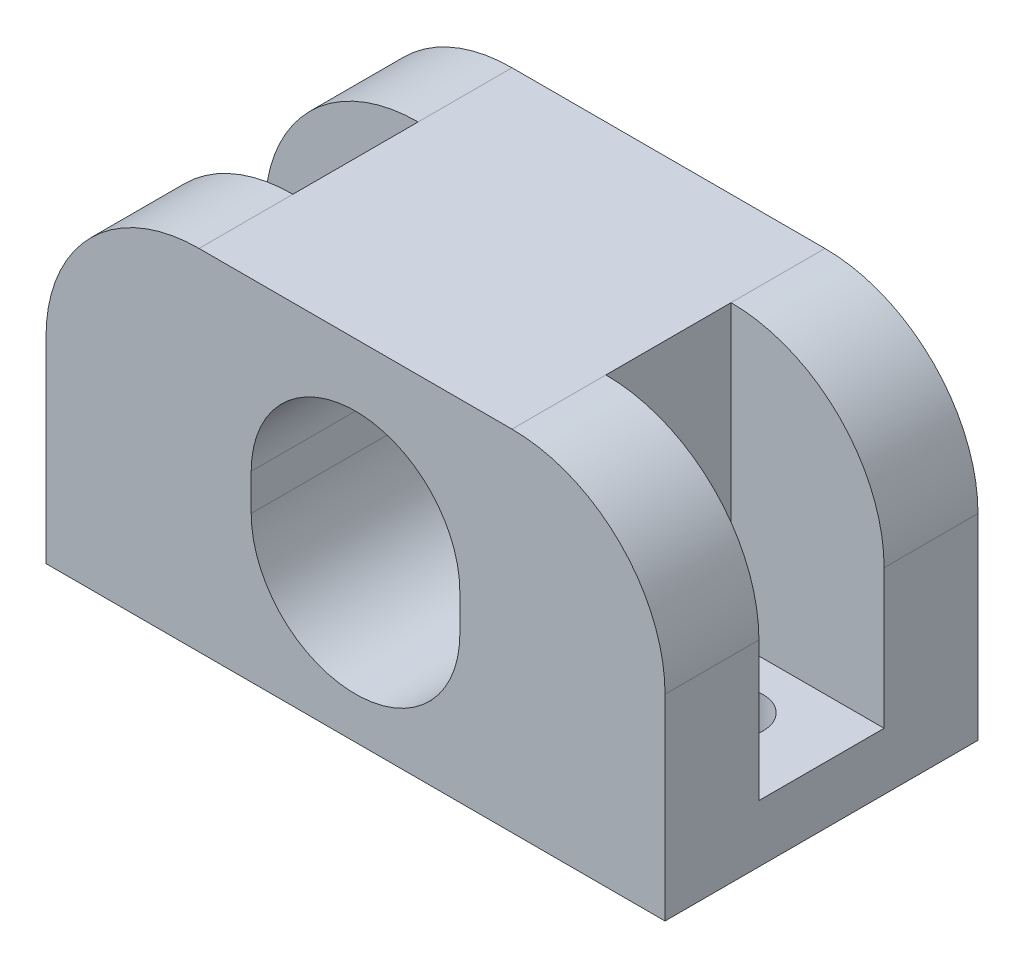
ISO-10303-21;
HEADER;
FILE_DESCRIPTION(('STEP AP214'),'2;1');
FILE_NAME('part.step','',(''),(''),'','','');
FILE_SCHEMA(('AUTOMOTIVE_DESIGN { 1 0 10303 214 1 1 1 1 }'));
ENDSEC;
DATA;
#1=APPLICATION_CONTEXT('core data for automotive mechanical design processes');
#2=APPLICATION_PROTOCOL_DEFINITION('international standard','automotive_design',2000,#1);
#3=PRODUCT_CONTEXT('',#1,'mechanical');
#4=PRODUCT('Part','Part','',(#3));
#5=PRODUCT_RELATED_PRODUCT_CATEGORY('part','',(#4));
#6=PRODUCT_DEFINITION_FORMATION('','',#4);
#7=PRODUCT_DEFINITION_CONTEXT('part definition',#1,'design');
#8=PRODUCT_DEFINITION('design','',#6,#7);
#9=PRODUCT_DEFINITION_SHAPE('','',#8);
#10=(LENGTH_UNIT() NAMED_UNIT(*) SI_UNIT(.MILLI.,.METRE.));
#11=(NAMED_UNIT(*) PLANE_ANGLE_UNIT() SI_UNIT($,.RADIAN.));
#12=(NAMED_UNIT(*) SI_UNIT($,.STERADIAN.) SOLID_ANGLE_UNIT());
#13=UNCERTAINTY_MEASURE_WITH_UNIT(LENGTH_MEASURE(1.E-05),#10,'distance_accuracy_value','');
#14=(GEOMETRIC_REPRESENTATION_CONTEXT(3) GLOBAL_UNCERTAINTY_ASSIGNED_CONTEXT((#13)) GLOBAL_UNIT_ASSIGNED_CONTEXT((#10,
#11,#12)) REPRESENTATION_CONTEXT('',''));
#15=CARTESIAN_POINT('',(0.,0.,0.));
#16=DIRECTION('',(0.,0.,1.));
#17=DIRECTION('',(1.,0.,0.));
#18=AXIS2_PLACEMENT_3D('',#15,#16,#17);
#19=CARTESIAN_POINT('',(7.5,7.415,-15.));
#20=DIRECTION('',(0.,0.,1.));
#21=DIRECTION('',(1.,0.,0.));
#22=AXIS2_PLACEMENT_3D('',#19,#20,#21);
#23=CYLINDRICAL_SURFACE('',#22,7.335);
#24=DIRECTION('',(0.,0.,1.));
#25=VECTOR('',#24,1.);
#26=CARTESIAN_POINT('',(14.835,7.415,-15.));
#27=LINE('',#26,#25);
#28=CARTESIAN_POINT('',(14.835,7.415,-4.5));
#29=VERTEX_POINT('',#28);
#30=CARTESIAN_POINT('',(14.835,7.415,0.));
#31=VERTEX_POINT('',#30);
#32=EDGE_CURVE('E298',#29,#31,#27,.T.);
#33=ORIENTED_EDGE('',*,*,#32,.F.);
#34=CARTESIAN_POINT('',(7.5,7.415,-4.5));
#35=DIRECTION('',(0.,0.,-1.));
#36=DIRECTION('',(-1.,0.,0.));
#37=AXIS2_PLACEMENT_3D('',#34,#35,#36);
#38=CIRCLE('',#37,7.335);
#39=CARTESIAN_POINT('',(7.5,14.75,-4.5));
#40=VERTEX_POINT('',#39);
#41=EDGE_CURVE('E192',#29,#40,#38,.F.);
#42=ORIENTED_EDGE('',*,*,#41,.T.);
#43=DIRECTION('',(0.,0.,1.));
#44=VECTOR('',#43,1.);
#45=CARTESIAN_POINT('',(7.5,14.75,-15.));
#46=LINE('',#45,#44);
#47=CARTESIAN_POINT('',(7.5,14.75,0.));
#48=VERTEX_POINT('',#47);
#49=EDGE_CURVE('E280',#40,#48,#46,.T.);
#50=ORIENTED_EDGE('',*,*,#49,.T.);
#51=CARTESIAN_POINT('',(7.5,7.415,0.));
#52=DIRECTION('',(0.,0.,1.));
#53=DIRECTION('',(-1.,0.,0.));
#54=AXIS2_PLACEMENT_3D('',#51,#52,#53);
#55=CIRCLE('',#54,7.335);
#56=EDGE_CURVE('E256',#31,#48,#55,.T.);
#57=ORIENTED_EDGE('',*,*,#56,.F.);
#58=EDGE_LOOP('',(#33,#42,#50,#57));
#59=FACE_BOUND('',#58,.T.);
#60=ADVANCED_FACE('F43',(#59),#23,.T.);
#61=CARTESIAN_POINT('',(-14.835,-2.,-15.));
#62=DIRECTION('',(-1.,0.,0.));
#63=DIRECTION('',(0.,0.,1.));
#64=AXIS2_PLACEMENT_3D('',#61,#62,#63);
#65=PLANE('',#64);
#66=DIRECTION('',(0.,0.,1.));
#67=VECTOR('',#66,1.);
#68=CARTESIAN_POINT('',(-14.835,0.749999999999999,-10.5));
#69=LINE('',#68,#67);
#70=CARTESIAN_POINT('',(-14.835,0.749999999999999,-10.5));
#71=VERTEX_POINT('',#70);
#72=CARTESIAN_POINT('',(-14.835,0.749999999999999,-4.5));
#73=VERTEX_POINT('',#72);
#74=EDGE_CURVE('E216',#71,#73,#69,.T.);
#75=ORIENTED_EDGE('',*,*,#74,.F.);
#76=DIRECTION('',(0.,1.,0.));
#77=VECTOR('',#76,1.);
#78=CARTESIAN_POINT('',(-14.835,0.749999999999999,-10.5));
#79=LINE('',#78,#77);
#80=CARTESIAN_POINT('',(-14.835,7.415,-10.5));
#81=VERTEX_POINT('',#80);
#82=EDGE_CURVE('E219',#71,#81,#79,.T.);
#83=ORIENTED_EDGE('',*,*,#82,.T.);
#84=DIRECTION('',(0.,0.,1.));
#85=VECTOR('',#84,1.);
#86=CARTESIAN_POINT('',(-14.835,7.415,-15.));
#87=LINE('',#86,#85);
#88=CARTESIAN_POINT('',(-14.835,7.415,-15.));
#89=VERTEX_POINT('',#88);
#90=EDGE_CURVE('E304',#89,#81,#87,.T.);
#91=ORIENTED_EDGE('',*,*,#90,.F.);
#92=DIRECTION('',(0.,-1.,0.));
#93=VECTOR('',#92,1.);
#94=CARTESIAN_POINT('',(-14.835,-2.,-15.));
#95=LINE('',#94,#93);
#96=CARTESIAN_POINT('',(-14.835,-2.,-15.));
#97=VERTEX_POINT('',#96);
#98=EDGE_CURVE('E273',#89,#97,#95,.T.);
#99=ORIENTED_EDGE('',*,*,#98,.T.);
#100=DIRECTION('',(0.,0.,1.));
#101=VECTOR('',#100,1.);
#102=CARTESIAN_POINT('',(-14.835,-2.,-15.));
#103=LINE('',#102,#101);
#104=CARTESIAN_POINT('',(-14.835,-2.,0.));
#105=VERTEX_POINT('',#104);
#106=EDGE_CURVE('E301',#97,#105,#103,.T.);
#107=ORIENTED_EDGE('',*,*,#106,.T.);
#108=DIRECTION('',(0.,-1.,0.));
#109=VECTOR('',#108,1.);
#110=CARTESIAN_POINT('',(-14.835,-2.,0.));
#111=LINE('',#110,#109);
#112=CARTESIAN_POINT('',(-14.835,7.415,0.));
#113=VERTEX_POINT('',#112);
#114=EDGE_CURVE('E289',#113,#105,#111,.T.);
#115=ORIENTED_EDGE('',*,*,#114,.F.);
#116=CARTESIAN_POINT('',(-14.835,7.415,-4.5));
#117=VERTEX_POINT('',#116);
#118=EDGE_CURVE('E307',#117,#113,#87,.T.);
#119=ORIENTED_EDGE('',*,*,#118,.F.);
#120=DIRECTION('',(0.,1.,0.));
#121=VECTOR('',#120,1.);
#122=CARTESIAN_POINT('',(-14.835,0.749999999999999,-4.5));
#123=LINE('',#122,#121);
#124=EDGE_CURVE('E224',#73,#117,#123,.T.);
#125=ORIENTED_EDGE('',*,*,#124,.F.);
#126=EDGE_LOOP('',(#75,#83,#91,#99,#107,#115,#119,#125));
#127=FACE_BOUND('',#126,.T.);
#128=ADVANCED_FACE('F335',(#127),#65,.T.);
#129=CARTESIAN_POINT('',(-7.5,7.415,-15.));
#130=DIRECTION('',(0.,0.,1.));
#131=DIRECTION('',(1.,0.,0.));
#132=AXIS2_PLACEMENT_3D('',#129,#130,#131);
#133=CYLINDRICAL_SURFACE('',#132,7.335);
#134=ORIENTED_EDGE('',*,*,#90,.T.);
#135=CARTESIAN_POINT('',(-7.5,7.415,-10.5));
#136=DIRECTION('',(0.,0.,1.));
#137=DIRECTION('',(1.,0.,0.));
#138=AXIS2_PLACEMENT_3D('',#135,#136,#137);
#139=CIRCLE('',#138,7.335);
#140=CARTESIAN_POINT('',(-7.5,14.75,-10.5));
#141=VERTEX_POINT('',#140);
#142=EDGE_CURVE('E11',#81,#141,#139,.F.);
#143=ORIENTED_EDGE('',*,*,#142,.T.);
#144=DIRECTION('',(0.,0.,1.));
#145=VECTOR('',#144,1.);
#146=CARTESIAN_POINT('',(-7.5,14.75,-15.));
#147=LINE('',#146,#145);
#148=CARTESIAN_POINT('',(-7.5,14.75,-15.));
#149=VERTEX_POINT('',#148);
#150=EDGE_CURVE('E308',#149,#141,#147,.T.);
#151=ORIENTED_EDGE('',*,*,#150,.F.);
#152=CARTESIAN_POINT('',(-7.5,7.415,-15.));
#153=DIRECTION('',(0.,0.,1.));
#154=DIRECTION('',(1.,0.,0.));
#155=AXIS2_PLACEMENT_3D('',#152,#153,#154);
#156=CIRCLE('',#155,7.335);
#157=EDGE_CURVE('E270',#149,#89,#156,.T.);
#158=ORIENTED_EDGE('',*,*,#157,.T.);
#159=EDGE_LOOP('',(#134,#143,#151,#158));
#160=FACE_BOUND('',#159,.T.);
#161=ADVANCED_FACE('F341',(#160),#133,.T.);
#162=CARTESIAN_POINT('',(7.5,7.415,-10.5));
#163=DIRECTION('',(0.,0.,-1.));
#164=DIRECTION('',(-1.,0.,0.));
#165=AXIS2_PLACEMENT_3D('',#162,#163,#164);
#166=CIRCLE('',#165,7.335);
#167=CARTESIAN_POINT('',(14.835,7.415,-10.5));
#168=VERTEX_POINT('',#167);
#169=CARTESIAN_POINT('',(7.5,14.75,-10.5));
#170=VERTEX_POINT('',#169);
#171=EDGE_CURVE('E196',#168,#170,#166,.F.);
#172=ORIENTED_EDGE('',*,*,#171,.F.);
#173=CARTESIAN_POINT('',(14.835,7.415,-15.));
#174=VERTEX_POINT('',#173);
#175=EDGE_CURVE('E191',#174,#168,#27,.T.);
#176=ORIENTED_EDGE('',*,*,#175,.F.);
#177=CARTESIAN_POINT('',(7.5,7.415,-15.));
#178=DIRECTION('',(0.,0.,1.));
#179=DIRECTION('',(-1.,0.,0.));
#180=AXIS2_PLACEMENT_3D('',#177,#178,#179);
#181=CIRCLE('',#180,7.335);
#182=CARTESIAN_POINT('',(7.5,14.75,-15.));
#183=VERTEX_POINT('',#182);
#184=EDGE_CURVE('E263',#174,#183,#181,.T.);
#185=ORIENTED_EDGE('',*,*,#184,.T.);
#186=EDGE_CURVE('E312',#183,#170,#46,.T.);
#187=ORIENTED_EDGE('',*,*,#186,.T.);
#188=EDGE_LOOP('',(#172,#176,#185,#187));
#189=FACE_BOUND('',#188,.T.);
#190=ADVANCED_FACE('F45',(#189),#23,.T.);
#191=CARTESIAN_POINT('',(14.835,-2.,-15.));
#192=DIRECTION('',(1.,0.,0.));
#193=DIRECTION('',(0.,0.,-1.));
#194=AXIS2_PLACEMENT_3D('',#191,#192,#193);
#195=PLANE('',#194);
#196=DIRECTION('',(0.,1.,0.));
#197=VECTOR('',#196,1.);
#198=CARTESIAN_POINT('',(14.835,0.749999999999999,-10.5));
#199=LINE('',#198,#197);
#200=CARTESIAN_POINT('',(14.835,0.749999999999999,-10.5));
#201=VERTEX_POINT('',#200);
#202=EDGE_CURVE('E184',#201,#168,#199,.T.);
#203=ORIENTED_EDGE('',*,*,#202,.F.);
#204=DIRECTION('',(0.,0.,1.));
#205=VECTOR('',#204,1.);
#206=CARTESIAN_POINT('',(14.835,0.749999999999999,-10.5));
#207=LINE('',#206,#205);
#208=CARTESIAN_POINT('',(14.835,0.749999999999999,-4.5));
#209=VERTEX_POINT('',#208);
#210=EDGE_CURVE('E172',#201,#209,#207,.T.);
#211=ORIENTED_EDGE('',*,*,#210,.T.);
#212=DIRECTION('',(0.,1.,0.));
#213=VECTOR('',#212,1.);
#214=CARTESIAN_POINT('',(14.835,0.749999999999999,-4.5));
#215=LINE('',#214,#213);
#216=EDGE_CURVE('E193',#209,#29,#215,.T.);
#217=ORIENTED_EDGE('',*,*,#216,.T.);
#218=ORIENTED_EDGE('',*,*,#32,.T.);
#219=DIRECTION('',(0.,1.,0.));
#220=VECTOR('',#219,1.);
#221=CARTESIAN_POINT('',(14.835,-2.,0.));
#222=LINE('',#221,#220);
#223=CARTESIAN_POINT('',(14.835,-2.,0.));
#224=VERTEX_POINT('',#223);
#225=EDGE_CURVE('E267',#224,#31,#222,.T.);
#226=ORIENTED_EDGE('',*,*,#225,.F.);
#227=DIRECTION('',(0.,0.,1.));
#228=VECTOR('',#227,1.);
#229=CARTESIAN_POINT('',(14.835,-2.,-15.));
#230=LINE('',#229,#228);
#231=CARTESIAN_POINT('',(14.835,-2.,-15.));
#232=VERTEX_POINT('',#231);
#233=EDGE_CURVE('E299',#232,#224,#230,.T.);
#234=ORIENTED_EDGE('',*,*,#233,.F.);
#235=DIRECTION('',(0.,1.,0.));
#236=VECTOR('',#235,1.);
#237=CARTESIAN_POINT('',(14.835,-2.,-15.));
#238=LINE('',#237,#236);
#239=EDGE_CURVE('E278',#232,#174,#238,.T.);
#240=ORIENTED_EDGE('',*,*,#239,.T.);
#241=ORIENTED_EDGE('',*,*,#175,.T.);
#242=EDGE_LOOP('',(#203,#211,#217,#218,#226,#234,#240,#241));
#243=FACE_BOUND('',#242,.T.);
#244=ADVANCED_FACE('F189',(#243),#195,.T.);
#245=CARTESIAN_POINT('',(0.,-2.,-15.));
#246=DIRECTION('',(0.,-1.,0.));
#247=DIRECTION('',(0.,0.,-1.));
#248=AXIS2_PLACEMENT_3D('',#245,#246,#247);
#249=PLANE('',#248);
#250=CARTESIAN_POINT('',(10.54250606,-2.,-7.5));
#251=DIRECTION('',(0.,-1.,0.));
#252=DIRECTION('',(0.,0.,1.));
#253=AXIS2_PLACEMENT_3D('',#250,#251,#252);
#254=CIRCLE('',#253,1.5);
#255=CARTESIAN_POINT('',(10.54250606,-2.,-6.));
#256=VERTEX_POINT('',#255);
#257=EDGE_CURVE('E365',#256,#256,#254,.T.);
#258=ORIENTED_EDGE('',*,*,#257,.F.);
#259=EDGE_LOOP('',(#258));
#260=FACE_BOUND('',#259,.T.);
#261=CARTESIAN_POINT('',(-10.54250606,-2.,-7.5));
#262=DIRECTION('',(0.,1.,0.));
#263=DIRECTION('',(0.,0.,1.));
#264=AXIS2_PLACEMENT_3D('',#261,#262,#263);
#265=CIRCLE('',#264,1.5);
#266=CARTESIAN_POINT('',(-10.54250606,-2.,-6.));
#267=VERTEX_POINT('',#266);
#268=EDGE_CURVE('E203',#267,#267,#265,.T.);
#269=ORIENTED_EDGE('',*,*,#268,.T.);
#270=EDGE_LOOP('',(#269));
#271=FACE_BOUND('',#270,.T.);
#272=DIRECTION('',(1.,0.,0.));
#273=VECTOR('',#272,1.);
#274=CARTESIAN_POINT('',(0.,-2.,0.));
#275=LINE('',#274,#273);
#276=EDGE_CURVE('E292',#105,#224,#275,.T.);
#277=ORIENTED_EDGE('',*,*,#276,.F.);
#278=ORIENTED_EDGE('',*,*,#106,.F.);
#279=DIRECTION('',(1.,0.,0.));
#280=VECTOR('',#279,1.);
#281=CARTESIAN_POINT('',(0.,-2.,-15.));
#282=LINE('',#281,#280);
#283=EDGE_CURVE('E276',#97,#232,#282,.T.);
#284=ORIENTED_EDGE('',*,*,#283,.T.);
#285=ORIENTED_EDGE('',*,*,#233,.T.);
#286=EDGE_LOOP('',(#277,#278,#284,#285));
#287=FACE_BOUND('',#286,.T.);
#288=ADVANCED_FACE('F349',(#260,#271,#287),#249,.T.);
#289=CARTESIAN_POINT('',(-7.5,7.415,-4.5));
#290=DIRECTION('',(0.,0.,1.));
#291=DIRECTION('',(1.,0.,0.));
#292=AXIS2_PLACEMENT_3D('',#289,#290,#291);
#293=CIRCLE('',#292,7.335);
#294=CARTESIAN_POINT('',(-7.5,14.75,-4.5));
#295=VERTEX_POINT('',#294);
#296=EDGE_CURVE('E52',#117,#295,#293,.F.);
#297=ORIENTED_EDGE('',*,*,#296,.F.);
#298=ORIENTED_EDGE('',*,*,#118,.T.);
#299=CARTESIAN_POINT('',(-7.5,7.415,0.));
#300=DIRECTION('',(0.,0.,1.));
#301=DIRECTION('',(1.,0.,0.));
#302=AXIS2_PLACEMENT_3D('',#299,#300,#301);
#303=CIRCLE('',#302,7.335);
#304=CARTESIAN_POINT('',(-7.5,14.75,0.));
#305=VERTEX_POINT('',#304);
#306=EDGE_CURVE('E286',#305,#113,#303,.T.);
#307=ORIENTED_EDGE('',*,*,#306,.F.);
#308=EDGE_CURVE('E311',#295,#305,#147,.T.);
#309=ORIENTED_EDGE('',*,*,#308,.F.);
#310=EDGE_LOOP('',(#297,#298,#307,#309));
#311=FACE_BOUND('',#310,.T.);
#312=ADVANCED_FACE('F354',(#311),#133,.T.);
#313=CARTESIAN_POINT('',(-7.5,14.75,-15.));
#314=DIRECTION('',(0.,1.,0.));
#315=DIRECTION('',(-1.,0.,0.));
#316=AXIS2_PLACEMENT_3D('',#313,#314,#315);
#317=PLANE('',#316);
#318=DIRECTION('',(-1.,0.,0.));
#319=VECTOR('',#318,1.);
#320=CARTESIAN_POINT('',(-7.5,14.75,0.));
#321=LINE('',#320,#319);
#322=EDGE_CURVE('E283',#48,#305,#321,.T.);
#323=ORIENTED_EDGE('',*,*,#322,.F.);
#324=ORIENTED_EDGE('',*,*,#49,.F.);
#325=DIRECTION('',(0.,0.,1.));
#326=VECTOR('',#325,1.);
#327=CARTESIAN_POINT('',(7.5,14.75,-10.5));
#328=LINE('',#327,#326);
#329=EDGE_CURVE('E186',#170,#40,#328,.T.);
#330=ORIENTED_EDGE('',*,*,#329,.F.);
#331=ORIENTED_EDGE('',*,*,#186,.F.);
#332=DIRECTION('',(-1.,0.,0.));
#333=VECTOR('',#332,1.);
#334=CARTESIAN_POINT('',(-7.5,14.75,-15.));
#335=LINE('',#334,#333);
#336=EDGE_CURVE('E266',#183,#149,#335,.T.);
#337=ORIENTED_EDGE('',*,*,#336,.T.);
#338=ORIENTED_EDGE('',*,*,#150,.T.);
#339=DIRECTION('',(0.,0.,1.));
#340=VECTOR('',#339,1.);
#341=CARTESIAN_POINT('',(-7.5,14.75,-10.5));
#342=LINE('',#341,#340);
#343=EDGE_CURVE('E211',#141,#295,#342,.T.);
#344=ORIENTED_EDGE('',*,*,#343,.T.);
#345=ORIENTED_EDGE('',*,*,#308,.T.);
#346=EDGE_LOOP('',(#323,#324,#330,#331,#337,#338,#344,#345));
#347=FACE_BOUND('',#346,.T.);
#348=ADVANCED_FACE('F360',(#347),#317,.T.);
#349=CARTESIAN_POINT('',(7.5,7.415,-15.));
#350=DIRECTION('',(0.,0.,-1.));
#351=DIRECTION('',(-1.,0.,0.));
#352=AXIS2_PLACEMENT_3D('',#349,#350,#351);
#353=PLANE('',#352);
#354=CARTESIAN_POINT('',(0.,5.,-15.));
#355=DIRECTION('',(0.,0.,1.));
#356=DIRECTION('',(1.,0.,0.));
#357=AXIS2_PLACEMENT_3D('',#354,#355,#356);
#358=CIRCLE('',#357,5.);
#359=CARTESIAN_POINT('',(-5.,5.,-15.));
#360=VERTEX_POINT('',#359);
#361=CARTESIAN_POINT('',(5.,5.,-15.));
#362=VERTEX_POINT('',#361);
#363=EDGE_CURVE('E231',#360,#362,#358,.T.);
#364=ORIENTED_EDGE('',*,*,#363,.T.);
#365=DIRECTION('',(0.,1.,0.));
#366=VECTOR('',#365,1.);
#367=CARTESIAN_POINT('',(5.,6.75,-15.));
#368=LINE('',#367,#366);
#369=CARTESIAN_POINT('',(5.,6.75,-15.));
#370=VERTEX_POINT('',#369);
#371=EDGE_CURVE('E234',#362,#370,#368,.T.);
#372=ORIENTED_EDGE('',*,*,#371,.T.);
#373=CARTESIAN_POINT('',(0.,6.75,-15.));
#374=DIRECTION('',(0.,0.,1.));
#375=DIRECTION('',(-1.,0.,0.));
#376=AXIS2_PLACEMENT_3D('',#373,#374,#375);
#377=CIRCLE('',#376,5.);
#378=CARTESIAN_POINT('',(-5.,6.75,-15.));
#379=VERTEX_POINT('',#378);
#380=EDGE_CURVE('E238',#370,#379,#377,.T.);
#381=ORIENTED_EDGE('',*,*,#380,.T.);
#382=DIRECTION('',(0.,-1.,0.));
#383=VECTOR('',#382,1.);
#384=CARTESIAN_POINT('',(-5.,6.75,-15.));
#385=LINE('',#384,#383);
#386=EDGE_CURVE('E241',#379,#360,#385,.T.);
#387=ORIENTED_EDGE('',*,*,#386,.T.);
#388=EDGE_LOOP('',(#364,#372,#381,#387));
#389=FACE_BOUND('',#388,.T.);
#390=ORIENTED_EDGE('',*,*,#184,.F.);
#391=ORIENTED_EDGE('',*,*,#239,.F.);
#392=ORIENTED_EDGE('',*,*,#283,.F.);
#393=ORIENTED_EDGE('',*,*,#98,.F.);
#394=ORIENTED_EDGE('',*,*,#157,.F.);
#395=ORIENTED_EDGE('',*,*,#336,.F.);
#396=EDGE_LOOP('',(#390,#391,#392,#393,#394,#395));
#397=FACE_BOUND('',#396,.T.);
#398=ADVANCED_FACE('F405',(#389,#397),#353,.T.);
#399=CARTESIAN_POINT('',(7.5,7.415,0.));
#400=DIRECTION('',(0.,0.,-1.));
#401=DIRECTION('',(-1.,0.,0.));
#402=AXIS2_PLACEMENT_3D('',#399,#400,#401);
#403=PLANE('',#402);
#404=DIRECTION('',(0.,1.,0.));
#405=VECTOR('',#404,1.);
#406=CARTESIAN_POINT('',(5.,6.75,0.));
#407=LINE('',#406,#405);
#408=CARTESIAN_POINT('',(5.,5.,0.));
#409=VERTEX_POINT('',#408);
#410=CARTESIAN_POINT('',(5.,6.75,0.));
#411=VERTEX_POINT('',#410);
#412=EDGE_CURVE('E246',#409,#411,#407,.T.);
#413=ORIENTED_EDGE('',*,*,#412,.F.);
#414=CARTESIAN_POINT('',(0.,5.,0.));
#415=DIRECTION('',(0.,0.,1.));
#416=DIRECTION('',(1.,0.,0.));
#417=AXIS2_PLACEMENT_3D('',#414,#415,#416);
#418=CIRCLE('',#417,5.);
#419=CARTESIAN_POINT('',(-5.,5.,0.));
#420=VERTEX_POINT('',#419);
#421=EDGE_CURVE('E230',#420,#409,#418,.T.);
#422=ORIENTED_EDGE('',*,*,#421,.F.);
#423=DIRECTION('',(0.,-1.,0.));
#424=VECTOR('',#423,1.);
#425=CARTESIAN_POINT('',(-5.,6.75,0.));
#426=LINE('',#425,#424);
#427=CARTESIAN_POINT('',(-5.,6.75,0.));
#428=VERTEX_POINT('',#427);
#429=EDGE_CURVE('E235',#428,#420,#426,.T.);
#430=ORIENTED_EDGE('',*,*,#429,.F.);
#431=CARTESIAN_POINT('',(0.,6.75,0.));
#432=DIRECTION('',(0.,0.,1.));
#433=DIRECTION('',(-1.,0.,0.));
#434=AXIS2_PLACEMENT_3D('',#431,#432,#433);
#435=CIRCLE('',#434,5.);
#436=EDGE_CURVE('E249',#411,#428,#435,.T.);
#437=ORIENTED_EDGE('',*,*,#436,.F.);
#438=EDGE_LOOP('',(#413,#422,#430,#437));
#439=FACE_BOUND('',#438,.T.);
#440=ORIENTED_EDGE('',*,*,#56,.T.);
#441=ORIENTED_EDGE('',*,*,#322,.T.);
#442=ORIENTED_EDGE('',*,*,#306,.T.);
#443=ORIENTED_EDGE('',*,*,#114,.T.);
#444=ORIENTED_EDGE('',*,*,#276,.T.);
#445=ORIENTED_EDGE('',*,*,#225,.T.);
#446=EDGE_LOOP('',(#440,#441,#442,#443,#444,#445));
#447=FACE_BOUND('',#446,.T.);
#448=ADVANCED_FACE('F391',(#439,#447),#403,.F.);
#449=CARTESIAN_POINT('',(0.,5.,-15.));
#450=DIRECTION('',(0.,0.,1.));
#451=DIRECTION('',(1.,0.,0.));
#452=AXIS2_PLACEMENT_3D('',#449,#450,#451);
#453=CYLINDRICAL_SURFACE('',#452,5.);
#454=ORIENTED_EDGE('',*,*,#421,.T.);
#455=DIRECTION('',(0.,0.,1.));
#456=VECTOR('',#455,1.);
#457=CARTESIAN_POINT('',(5.,5.,-15.));
#458=LINE('',#457,#456);
#459=EDGE_CURVE('E244',#362,#409,#458,.T.);
#460=ORIENTED_EDGE('',*,*,#459,.F.);
#461=ORIENTED_EDGE('',*,*,#363,.F.);
#462=DIRECTION('',(0.,0.,1.));
#463=VECTOR('',#462,1.);
#464=CARTESIAN_POINT('',(-5.,5.,-15.));
#465=LINE('',#464,#463);
#466=EDGE_CURVE('E254',#360,#420,#465,.T.);
#467=ORIENTED_EDGE('',*,*,#466,.T.);
#468=EDGE_LOOP('',(#454,#460,#461,#467));
#469=FACE_BOUND('',#468,.T.);
#470=ADVANCED_FACE('F414',(#469),#453,.F.);
#471=CARTESIAN_POINT('',(-5.,6.75,-15.));
#472=DIRECTION('',(-1.,0.,0.));
#473=DIRECTION('',(0.,0.,1.));
#474=AXIS2_PLACEMENT_3D('',#471,#472,#473);
#475=PLANE('',#474);
#476=ORIENTED_EDGE('',*,*,#429,.T.);
#477=ORIENTED_EDGE('',*,*,#466,.F.);
#478=ORIENTED_EDGE('',*,*,#386,.F.);
#479=DIRECTION('',(0.,0.,1.));
#480=VECTOR('',#479,1.);
#481=CARTESIAN_POINT('',(-5.,6.75,-15.));
#482=LINE('',#481,#480);
#483=EDGE_CURVE('E257',#379,#428,#482,.T.);
#484=ORIENTED_EDGE('',*,*,#483,.T.);
#485=EDGE_LOOP('',(#476,#477,#478,#484));
#486=FACE_BOUND('',#485,.T.);
#487=ADVANCED_FACE('F544',(#486),#475,.F.);
#488=CARTESIAN_POINT('',(0.,6.75,-15.));
#489=DIRECTION('',(0.,0.,1.));
#490=DIRECTION('',(1.,0.,0.));
#491=AXIS2_PLACEMENT_3D('',#488,#489,#490);
#492=CYLINDRICAL_SURFACE('',#491,5.);
#493=ORIENTED_EDGE('',*,*,#436,.T.);
#494=ORIENTED_EDGE('',*,*,#483,.F.);
#495=ORIENTED_EDGE('',*,*,#380,.F.);
#496=DIRECTION('',(0.,0.,1.));
#497=VECTOR('',#496,1.);
#498=CARTESIAN_POINT('',(5.,6.75,-15.));
#499=LINE('',#498,#497);
#500=EDGE_CURVE('E259',#370,#411,#499,.T.);
#501=ORIENTED_EDGE('',*,*,#500,.T.);
#502=EDGE_LOOP('',(#493,#494,#495,#501));
#503=FACE_BOUND('',#502,.T.);
#504=ADVANCED_FACE('F552',(#503),#492,.F.);
#505=CARTESIAN_POINT('',(5.,6.75,-15.));
#506=DIRECTION('',(1.,0.,0.));
#507=DIRECTION('',(0.,0.,-1.));
#508=AXIS2_PLACEMENT_3D('',#505,#506,#507);
#509=PLANE('',#508);
#510=ORIENTED_EDGE('',*,*,#412,.T.);
#511=ORIENTED_EDGE('',*,*,#500,.F.);
#512=ORIENTED_EDGE('',*,*,#371,.F.);
#513=ORIENTED_EDGE('',*,*,#459,.T.);
#514=EDGE_LOOP('',(#510,#511,#512,#513));
#515=FACE_BOUND('',#514,.T.);
#516=ADVANCED_FACE('F434',(#515),#509,.F.);
#517=CARTESIAN_POINT('',(-14.835,0.749999999999999,-10.5));
#518=DIRECTION('',(0.,0.,1.));
#519=DIRECTION('',(1.,0.,0.));
#520=AXIS2_PLACEMENT_3D('',#517,#518,#519);
#521=PLANE('',#520);
#522=ORIENTED_EDGE('',*,*,#82,.F.);
#523=DIRECTION('',(1.,0.,0.));
#524=VECTOR('',#523,1.);
#525=CARTESIAN_POINT('',(-14.835,0.749999999999999,-10.5));
#526=LINE('',#525,#524);
#527=CARTESIAN_POINT('',(-7.5,0.749999999999999,-10.5));
#528=VERTEX_POINT('',#527);
#529=EDGE_CURVE('E207',#71,#528,#526,.T.);
#530=ORIENTED_EDGE('',*,*,#529,.T.);
#531=DIRECTION('',(0.,1.,0.));
#532=VECTOR('',#531,1.);
#533=CARTESIAN_POINT('',(-7.5,0.749999999999999,-10.5));
#534=LINE('',#533,#532);
#535=EDGE_CURVE('E227',#528,#141,#534,.T.);
#536=ORIENTED_EDGE('',*,*,#535,.T.);
#537=ORIENTED_EDGE('',*,*,#142,.F.);
#538=EDGE_LOOP('',(#522,#530,#536,#537));
#539=FACE_BOUND('',#538,.T.);
#540=ADVANCED_FACE('F401',(#539),#521,.T.);
#541=CARTESIAN_POINT('',(-7.5,0.749999999999999,-10.5));
#542=DIRECTION('',(-1.,0.,0.));
#543=DIRECTION('',(0.,0.,1.));
#544=AXIS2_PLACEMENT_3D('',#541,#542,#543);
#545=PLANE('',#544);
#546=ORIENTED_EDGE('',*,*,#343,.F.);
#547=ORIENTED_EDGE('',*,*,#535,.F.);
#548=DIRECTION('',(0.,0.,1.));
#549=VECTOR('',#548,1.);
#550=CARTESIAN_POINT('',(-7.5,0.749999999999999,-10.5));
#551=LINE('',#550,#549);
#552=CARTESIAN_POINT('',(-7.5,0.749999999999999,-4.5));
#553=VERTEX_POINT('',#552);
#554=EDGE_CURVE('E210',#528,#553,#551,.T.);
#555=ORIENTED_EDGE('',*,*,#554,.T.);
#556=DIRECTION('',(0.,1.,0.));
#557=VECTOR('',#556,1.);
#558=CARTESIAN_POINT('',(-7.5,0.749999999999999,-4.5));
#559=LINE('',#558,#557);
#560=EDGE_CURVE('E68',#553,#295,#559,.T.);
#561=ORIENTED_EDGE('',*,*,#560,.T.);
#562=EDGE_LOOP('',(#546,#547,#555,#561));
#563=FACE_BOUND('',#562,.T.);
#564=ADVANCED_FACE('F402',(#563),#545,.T.);
#565=CARTESIAN_POINT('',(-14.835,0.749999999999999,-4.5));
#566=DIRECTION('',(0.,0.,1.));
#567=DIRECTION('',(1.,0.,0.));
#568=AXIS2_PLACEMENT_3D('',#565,#566,#567);
#569=PLANE('',#568);
#570=ORIENTED_EDGE('',*,*,#296,.T.);
#571=ORIENTED_EDGE('',*,*,#560,.F.);
#572=DIRECTION('',(1.,0.,0.));
#573=VECTOR('',#572,1.);
#574=CARTESIAN_POINT('',(-14.835,0.749999999999999,-4.5));
#575=LINE('',#574,#573);
#576=EDGE_CURVE('E213',#73,#553,#575,.T.);
#577=ORIENTED_EDGE('',*,*,#576,.F.);
#578=ORIENTED_EDGE('',*,*,#124,.T.);
#579=EDGE_LOOP('',(#570,#571,#577,#578));
#580=FACE_BOUND('',#579,.T.);
#581=ADVANCED_FACE('F332',(#580),#569,.F.);
#582=CARTESIAN_POINT('',(0.,0.749999999999999,0.));
#583=DIRECTION('',(0.,-1.,0.));
#584=DIRECTION('',(0.,0.,-1.));
#585=AXIS2_PLACEMENT_3D('',#582,#583,#584);
#586=PLANE('',#585);
#587=CARTESIAN_POINT('',(-10.54250606,0.749999999999999,-7.5));
#588=DIRECTION('',(0.,-1.,0.));
#589=DIRECTION('',(0.,0.,-1.));
#590=AXIS2_PLACEMENT_3D('',#587,#588,#589);
#591=CIRCLE('',#590,1.5);
#592=CARTESIAN_POINT('',(-10.54250606,0.749999999999999,-9.));
#593=VERTEX_POINT('',#592);
#594=EDGE_CURVE('E206',#593,#593,#591,.T.);
#595=ORIENTED_EDGE('',*,*,#594,.T.);
#596=EDGE_LOOP('',(#595));
#597=FACE_BOUND('',#596,.T.);
#598=ORIENTED_EDGE('',*,*,#529,.F.);
#599=ORIENTED_EDGE('',*,*,#74,.T.);
#600=ORIENTED_EDGE('',*,*,#576,.T.);
#601=ORIENTED_EDGE('',*,*,#554,.F.);
#602=EDGE_LOOP('',(#598,#599,#600,#601));
#603=FACE_BOUND('',#602,.T.);
#604=ADVANCED_FACE('F318',(#597,#603),#586,.F.);
#605=CARTESIAN_POINT('',(-10.54250606,-2.,-7.5));
#606=DIRECTION('',(0.,1.,0.));
#607=DIRECTION('',(0.,0.,1.));
#608=AXIS2_PLACEMENT_3D('',#605,#606,#607);
#609=CYLINDRICAL_SURFACE('',#608,1.5);
#610=ORIENTED_EDGE('',*,*,#268,.F.);
#611=EDGE_LOOP('',(#610));
#612=FACE_BOUND('',#611,.T.);
#613=ORIENTED_EDGE('',*,*,#594,.F.);
#614=EDGE_LOOP('',(#613));
#615=FACE_BOUND('',#614,.T.);
#616=ADVANCED_FACE('F321',(#612,#615),#609,.F.);
#617=CARTESIAN_POINT('',(14.835,0.749999999999999,-10.5));
#618=DIRECTION('',(0.,0.,-1.));
#619=DIRECTION('',(-1.,0.,0.));
#620=AXIS2_PLACEMENT_3D('',#617,#618,#619);
#621=PLANE('',#620);
#622=ORIENTED_EDGE('',*,*,#171,.T.);
#623=DIRECTION('',(0.,1.,0.));
#624=VECTOR('',#623,1.);
#625=CARTESIAN_POINT('',(7.5,0.749999999999999,-10.5));
#626=LINE('',#625,#624);
#627=CARTESIAN_POINT('',(7.5,0.749999999999999,-10.5));
#628=VERTEX_POINT('',#627);
#629=EDGE_CURVE('E60',#628,#170,#626,.T.);
#630=ORIENTED_EDGE('',*,*,#629,.F.);
#631=DIRECTION('',(-1.,0.,0.));
#632=VECTOR('',#631,1.);
#633=CARTESIAN_POINT('',(14.835,0.749999999999999,-10.5));
#634=LINE('',#633,#632);
#635=EDGE_CURVE('E176',#201,#628,#634,.T.);
#636=ORIENTED_EDGE('',*,*,#635,.F.);
#637=ORIENTED_EDGE('',*,*,#202,.T.);
#638=EDGE_LOOP('',(#622,#630,#636,#637));
#639=FACE_BOUND('',#638,.T.);
#640=ADVANCED_FACE('F183',(#639),#621,.F.);
#641=CARTESIAN_POINT('',(14.835,0.749999999999999,-4.5));
#642=DIRECTION('',(0.,0.,-1.));
#643=DIRECTION('',(-1.,0.,0.));
#644=AXIS2_PLACEMENT_3D('',#641,#642,#643);
#645=PLANE('',#644);
#646=ORIENTED_EDGE('',*,*,#216,.F.);
#647=DIRECTION('',(-1.,0.,0.));
#648=VECTOR('',#647,1.);
#649=CARTESIAN_POINT('',(14.835,0.749999999999999,-4.5));
#650=LINE('',#649,#648);
#651=CARTESIAN_POINT('',(7.5,0.749999999999999,-4.5));
#652=VERTEX_POINT('',#651);
#653=EDGE_CURVE('E177',#209,#652,#650,.T.);
#654=ORIENTED_EDGE('',*,*,#653,.T.);
#655=DIRECTION('',(0.,1.,0.));
#656=VECTOR('',#655,1.);
#657=CARTESIAN_POINT('',(7.5,0.749999999999999,-4.5));
#658=LINE('',#657,#656);
#659=EDGE_CURVE('E198',#652,#40,#658,.T.);
#660=ORIENTED_EDGE('',*,*,#659,.T.);
#661=ORIENTED_EDGE('',*,*,#41,.F.);
#662=EDGE_LOOP('',(#646,#654,#660,#661));
#663=FACE_BOUND('',#662,.T.);
#664=ADVANCED_FACE('F330',(#663),#645,.T.);
#665=CARTESIAN_POINT('',(7.5,0.749999999999999,-10.5));
#666=DIRECTION('',(-1.,0.,0.));
#667=DIRECTION('',(0.,0.,1.));
#668=AXIS2_PLACEMENT_3D('',#665,#666,#667);
#669=PLANE('',#668);
#670=ORIENTED_EDGE('',*,*,#329,.T.);
#671=ORIENTED_EDGE('',*,*,#659,.F.);
#672=DIRECTION('',(0.,0.,1.));
#673=VECTOR('',#672,1.);
#674=CARTESIAN_POINT('',(7.5,0.749999999999999,-10.5));
#675=LINE('',#674,#673);
#676=EDGE_CURVE('E368',#628,#652,#675,.T.);
#677=ORIENTED_EDGE('',*,*,#676,.F.);
#678=ORIENTED_EDGE('',*,*,#629,.T.);
#679=EDGE_LOOP('',(#670,#671,#677,#678));
#680=FACE_BOUND('',#679,.T.);
#681=ADVANCED_FACE('F371',(#680),#669,.F.);
#682=CARTESIAN_POINT('',(0.,0.749999999999999,0.));
#683=DIRECTION('',(0.,-1.,0.));
#684=DIRECTION('',(0.,0.,-1.));
#685=AXIS2_PLACEMENT_3D('',#682,#683,#684);
#686=PLANE('',#685);
#687=CARTESIAN_POINT('',(10.54250606,0.749999999999999,-7.5));
#688=DIRECTION('',(0.,-1.,0.));
#689=DIRECTION('',(0.,0.,-1.));
#690=AXIS2_PLACEMENT_3D('',#687,#688,#689);
#691=CIRCLE('',#690,1.5);
#692=CARTESIAN_POINT('',(10.54250606,0.749999999999999,-9.));
#693=VERTEX_POINT('',#692);
#694=EDGE_CURVE('E47',#693,#693,#691,.F.);
#695=ORIENTED_EDGE('',*,*,#694,.F.);
#696=EDGE_LOOP('',(#695));
#697=FACE_BOUND('',#696,.T.);
#698=ORIENTED_EDGE('',*,*,#635,.T.);
#699=ORIENTED_EDGE('',*,*,#676,.T.);
#700=ORIENTED_EDGE('',*,*,#653,.F.);
#701=ORIENTED_EDGE('',*,*,#210,.F.);
#702=EDGE_LOOP('',(#698,#699,#700,#701));
#703=FACE_BOUND('',#702,.T.);
#704=ADVANCED_FACE('F174',(#697,#703),#686,.F.);
#705=CARTESIAN_POINT('',(10.54250606,-2.,-7.5));
#706=DIRECTION('',(0.,1.,0.));
#707=DIRECTION('',(0.,0.,1.));
#708=AXIS2_PLACEMENT_3D('',#705,#706,#707);
#709=CYLINDRICAL_SURFACE('',#708,1.5);
#710=ORIENTED_EDGE('',*,*,#257,.T.);
#711=EDGE_LOOP('',(#710));
#712=FACE_BOUND('',#711,.T.);
#713=ORIENTED_EDGE('',*,*,#694,.T.);
#714=EDGE_LOOP('',(#713));
#715=FACE_BOUND('',#714,.T.);
#716=ADVANCED_FACE('F376',(#712,#715),#709,.F.);
#717=CLOSED_SHELL('',(#60,#128,#161,#190,#244,#288,#312,#348,#398,#448,#470,#487,#504,#516,#540,
#564,#581,#604,#616,#640,#664,#681,#704,#716));
#718=MANIFOLD_SOLID_BREP('B2',#717);
#719=ADVANCED_BREP_SHAPE_REPRESENTATION('',(#18,#718),#14);
#720=SHAPE_DEFINITION_REPRESENTATION(#9,#719);
ENDSEC;
END-ISO-10303-21;
